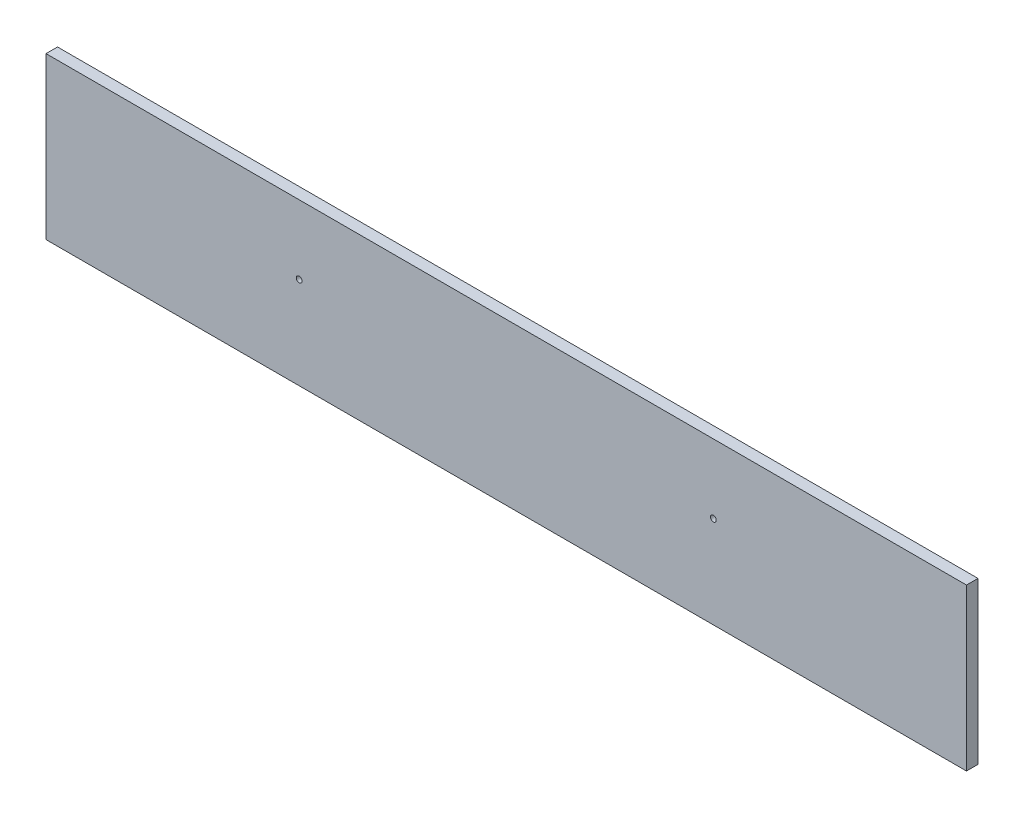
ISO-10303-21;
HEADER;
FILE_DESCRIPTION(('STEP AP214'),'2;1');
FILE_NAME('part.step','',(''),(''),'','','');
FILE_SCHEMA(('AUTOMOTIVE_DESIGN { 1 0 10303 214 1 1 1 1 }'));
ENDSEC;
DATA;
#1=APPLICATION_CONTEXT('core data for automotive mechanical design processes');
#2=APPLICATION_PROTOCOL_DEFINITION('international standard','automotive_design',2000,#1);
#3=PRODUCT_CONTEXT('',#1,'mechanical');
#4=PRODUCT('Part','Part','',(#3));
#5=PRODUCT_RELATED_PRODUCT_CATEGORY('part','',(#4));
#6=PRODUCT_DEFINITION_FORMATION('','',#4);
#7=PRODUCT_DEFINITION_CONTEXT('part definition',#1,'design');
#8=PRODUCT_DEFINITION('design','',#6,#7);
#9=PRODUCT_DEFINITION_SHAPE('','',#8);
#10=(LENGTH_UNIT() NAMED_UNIT(*) SI_UNIT(.MILLI.,.METRE.));
#11=(NAMED_UNIT(*) PLANE_ANGLE_UNIT() SI_UNIT($,.RADIAN.));
#12=(NAMED_UNIT(*) SI_UNIT($,.STERADIAN.) SOLID_ANGLE_UNIT());
#13=UNCERTAINTY_MEASURE_WITH_UNIT(LENGTH_MEASURE(1.E-05),#10,'distance_accuracy_value','');
#14=(GEOMETRIC_REPRESENTATION_CONTEXT(3) GLOBAL_UNCERTAINTY_ASSIGNED_CONTEXT((#13)) GLOBAL_UNIT_ASSIGNED_CONTEXT((#10,
#11,#12)) REPRESENTATION_CONTEXT('',''));
#15=CARTESIAN_POINT('',(0.,0.,0.));
#16=DIRECTION('',(0.,0.,1.));
#17=DIRECTION('',(1.,0.,0.));
#18=AXIS2_PLACEMENT_3D('',#15,#16,#17);
#19=CARTESIAN_POINT('',(0.,0.,5.));
#20=DIRECTION('',(0.,0.,-1.));
#21=DIRECTION('',(-1.,0.,0.));
#22=AXIS2_PLACEMENT_3D('',#19,#20,#21);
#23=PLANE('',#22);
#24=DIRECTION('',(0.,1.,0.));
#25=VECTOR('',#24,1.);
#26=CARTESIAN_POINT('',(200.,-40.,5.));
#27=LINE('',#26,#25);
#28=CARTESIAN_POINT('',(200.,-40.,5.));
#29=VERTEX_POINT('',#28);
#30=CARTESIAN_POINT('',(200.,30.,5.));
#31=VERTEX_POINT('',#30);
#32=EDGE_CURVE('E85',#29,#31,#27,.T.);
#33=ORIENTED_EDGE('',*,*,#32,.T.);
#34=DIRECTION('',(-1.,0.,0.));
#35=VECTOR('',#34,1.);
#36=CARTESIAN_POINT('',(-200.,30.,5.));
#37=LINE('',#36,#35);
#38=CARTESIAN_POINT('',(-200.,30.,5.));
#39=VERTEX_POINT('',#38);
#40=EDGE_CURVE('E80',#31,#39,#37,.T.);
#41=ORIENTED_EDGE('',*,*,#40,.T.);
#42=DIRECTION('',(0.,-1.,0.));
#43=VECTOR('',#42,1.);
#44=CARTESIAN_POINT('',(-200.,-40.,5.));
#45=LINE('',#44,#43);
#46=CARTESIAN_POINT('',(-200.,-40.,5.));
#47=VERTEX_POINT('',#46);
#48=EDGE_CURVE('E83',#39,#47,#45,.T.);
#49=ORIENTED_EDGE('',*,*,#48,.T.);
#50=DIRECTION('',(1.,0.,0.));
#51=VECTOR('',#50,1.);
#52=CARTESIAN_POINT('',(-200.,-40.,5.));
#53=LINE('',#52,#51);
#54=EDGE_CURVE('E50',#47,#29,#53,.T.);
#55=ORIENTED_EDGE('',*,*,#54,.T.);
#56=EDGE_LOOP('',(#33,#41,#49,#55));
#57=FACE_BOUND('',#56,.T.);
#58=CARTESIAN_POINT('',(-90.,0.,5.));
#59=DIRECTION('',(0.,0.,1.));
#60=DIRECTION('',(1.,0.,0.));
#61=AXIS2_PLACEMENT_3D('',#58,#59,#60);
#62=CIRCLE('',#61,1.25);
#63=CARTESIAN_POINT('',(-88.75,0.,5.));
#64=VERTEX_POINT('',#63);
#65=EDGE_CURVE('E100',#64,#64,#62,.T.);
#66=ORIENTED_EDGE('',*,*,#65,.F.);
#67=EDGE_LOOP('',(#66));
#68=FACE_BOUND('',#67,.T.);
#69=CARTESIAN_POINT('',(90.,0.,5.));
#70=DIRECTION('',(0.,0.,1.));
#71=DIRECTION('',(-1.,0.,0.));
#72=AXIS2_PLACEMENT_3D('',#69,#70,#71);
#73=CIRCLE('',#72,1.25);
#74=CARTESIAN_POINT('',(88.75,0.,5.));
#75=VERTEX_POINT('',#74);
#76=EDGE_CURVE('E115',#75,#75,#73,.T.);
#77=ORIENTED_EDGE('',*,*,#76,.F.);
#78=EDGE_LOOP('',(#77));
#79=FACE_BOUND('',#78,.T.);
#80=ADVANCED_FACE('F33',(#57,#68,#79),#23,.F.);
#81=CARTESIAN_POINT('',(0.,0.,0.));
#82=DIRECTION('',(0.,0.,-1.));
#83=DIRECTION('',(-1.,0.,0.));
#84=AXIS2_PLACEMENT_3D('',#81,#82,#83);
#85=PLANE('',#84);
#86=CARTESIAN_POINT('',(-90.,0.,0.));
#87=DIRECTION('',(0.,0.,1.));
#88=DIRECTION('',(1.,0.,0.));
#89=AXIS2_PLACEMENT_3D('',#86,#87,#88);
#90=CIRCLE('',#89,1.25);
#91=CARTESIAN_POINT('',(-88.75,0.,0.));
#92=VERTEX_POINT('',#91);
#93=EDGE_CURVE('E112',#92,#92,#90,.T.);
#94=ORIENTED_EDGE('',*,*,#93,.T.);
#95=EDGE_LOOP('',(#94));
#96=FACE_BOUND('',#95,.T.);
#97=DIRECTION('',(0.,1.,0.));
#98=VECTOR('',#97,1.);
#99=CARTESIAN_POINT('',(200.,-40.,0.));
#100=LINE('',#99,#98);
#101=CARTESIAN_POINT('',(200.,-40.,0.));
#102=VERTEX_POINT('',#101);
#103=CARTESIAN_POINT('',(200.,30.,0.));
#104=VERTEX_POINT('',#103);
#105=EDGE_CURVE('E97',#102,#104,#100,.T.);
#106=ORIENTED_EDGE('',*,*,#105,.F.);
#107=DIRECTION('',(1.,0.,0.));
#108=VECTOR('',#107,1.);
#109=CARTESIAN_POINT('',(-200.,-40.,0.));
#110=LINE('',#109,#108);
#111=CARTESIAN_POINT('',(-200.,-40.,0.));
#112=VERTEX_POINT('',#111);
#113=EDGE_CURVE('E73',#112,#102,#110,.T.);
#114=ORIENTED_EDGE('',*,*,#113,.F.);
#115=DIRECTION('',(0.,-1.,0.));
#116=VECTOR('',#115,1.);
#117=CARTESIAN_POINT('',(-200.,-40.,0.));
#118=LINE('',#117,#116);
#119=CARTESIAN_POINT('',(-200.,30.,0.));
#120=VERTEX_POINT('',#119);
#121=EDGE_CURVE('E67',#120,#112,#118,.T.);
#122=ORIENTED_EDGE('',*,*,#121,.F.);
#123=DIRECTION('',(-1.,0.,0.));
#124=VECTOR('',#123,1.);
#125=CARTESIAN_POINT('',(-200.,30.,0.));
#126=LINE('',#125,#124);
#127=EDGE_CURVE('E89',#104,#120,#126,.T.);
#128=ORIENTED_EDGE('',*,*,#127,.F.);
#129=EDGE_LOOP('',(#106,#114,#122,#128));
#130=FACE_BOUND('',#129,.T.);
#131=CARTESIAN_POINT('',(90.,0.,0.));
#132=DIRECTION('',(0.,0.,1.));
#133=DIRECTION('',(-1.,0.,0.));
#134=AXIS2_PLACEMENT_3D('',#131,#132,#133);
#135=CIRCLE('',#134,1.25);
#136=CARTESIAN_POINT('',(88.75,0.,0.));
#137=VERTEX_POINT('',#136);
#138=EDGE_CURVE('E118',#137,#137,#135,.T.);
#139=ORIENTED_EDGE('',*,*,#138,.T.);
#140=EDGE_LOOP('',(#139));
#141=FACE_BOUND('',#140,.T.);
#142=ADVANCED_FACE('F108',(#96,#130,#141),#85,.T.);
#143=CARTESIAN_POINT('',(200.,-40.,5.));
#144=DIRECTION('',(-1.,0.,0.));
#145=DIRECTION('',(0.,0.,1.));
#146=AXIS2_PLACEMENT_3D('',#143,#144,#145);
#147=PLANE('',#146);
#148=ORIENTED_EDGE('',*,*,#105,.T.);
#149=DIRECTION('',(0.,0.,-1.));
#150=VECTOR('',#149,1.);
#151=CARTESIAN_POINT('',(200.,30.,5.));
#152=LINE('',#151,#150);
#153=EDGE_CURVE('E11',#31,#104,#152,.T.);
#154=ORIENTED_EDGE('',*,*,#153,.F.);
#155=ORIENTED_EDGE('',*,*,#32,.F.);
#156=DIRECTION('',(0.,0.,-1.));
#157=VECTOR('',#156,1.);
#158=CARTESIAN_POINT('',(200.,-40.,5.));
#159=LINE('',#158,#157);
#160=EDGE_CURVE('E93',#29,#102,#159,.T.);
#161=ORIENTED_EDGE('',*,*,#160,.T.);
#162=EDGE_LOOP('',(#148,#154,#155,#161));
#163=FACE_BOUND('',#162,.T.);
#164=ADVANCED_FACE('F35',(#163),#147,.F.);
#165=CARTESIAN_POINT('',(-200.,30.,5.));
#166=DIRECTION('',(0.,-1.,0.));
#167=DIRECTION('',(1.,0.,0.));
#168=AXIS2_PLACEMENT_3D('',#165,#166,#167);
#169=PLANE('',#168);
#170=ORIENTED_EDGE('',*,*,#127,.T.);
#171=DIRECTION('',(0.,0.,-1.));
#172=VECTOR('',#171,1.);
#173=CARTESIAN_POINT('',(-200.,30.,5.));
#174=LINE('',#173,#172);
#175=EDGE_CURVE('E42',#39,#120,#174,.T.);
#176=ORIENTED_EDGE('',*,*,#175,.F.);
#177=ORIENTED_EDGE('',*,*,#40,.F.);
#178=ORIENTED_EDGE('',*,*,#153,.T.);
#179=EDGE_LOOP('',(#170,#176,#177,#178));
#180=FACE_BOUND('',#179,.T.);
#181=ADVANCED_FACE('F88',(#180),#169,.F.);
#182=CARTESIAN_POINT('',(-200.,-40.,5.));
#183=DIRECTION('',(1.,0.,0.));
#184=DIRECTION('',(0.,0.,-1.));
#185=AXIS2_PLACEMENT_3D('',#182,#183,#184);
#186=PLANE('',#185);
#187=ORIENTED_EDGE('',*,*,#121,.T.);
#188=DIRECTION('',(0.,0.,-1.));
#189=VECTOR('',#188,1.);
#190=CARTESIAN_POINT('',(-200.,-40.,5.));
#191=LINE('',#190,#189);
#192=EDGE_CURVE('E90',#47,#112,#191,.T.);
#193=ORIENTED_EDGE('',*,*,#192,.F.);
#194=ORIENTED_EDGE('',*,*,#48,.F.);
#195=ORIENTED_EDGE('',*,*,#175,.T.);
#196=EDGE_LOOP('',(#187,#193,#194,#195));
#197=FACE_BOUND('',#196,.T.);
#198=ADVANCED_FACE('F91',(#197),#186,.F.);
#199=CARTESIAN_POINT('',(-200.,-40.,5.));
#200=DIRECTION('',(0.,1.,0.));
#201=DIRECTION('',(-1.,0.,0.));
#202=AXIS2_PLACEMENT_3D('',#199,#200,#201);
#203=PLANE('',#202);
#204=ORIENTED_EDGE('',*,*,#113,.T.);
#205=ORIENTED_EDGE('',*,*,#160,.F.);
#206=ORIENTED_EDGE('',*,*,#54,.F.);
#207=ORIENTED_EDGE('',*,*,#192,.T.);
#208=EDGE_LOOP('',(#204,#205,#206,#207));
#209=FACE_BOUND('',#208,.T.);
#210=ADVANCED_FACE('F105',(#209),#203,.F.);
#211=CARTESIAN_POINT('',(-90.,0.,5.));
#212=DIRECTION('',(0.,0.,-1.));
#213=DIRECTION('',(-1.,0.,0.));
#214=AXIS2_PLACEMENT_3D('',#211,#212,#213);
#215=CYLINDRICAL_SURFACE('',#214,1.25);
#216=ORIENTED_EDGE('',*,*,#65,.T.);
#217=EDGE_LOOP('',(#216));
#218=FACE_BOUND('',#217,.T.);
#219=ORIENTED_EDGE('',*,*,#93,.F.);
#220=EDGE_LOOP('',(#219));
#221=FACE_BOUND('',#220,.T.);
#222=ADVANCED_FACE('F135',(#218,#221),#215,.F.);
#223=CARTESIAN_POINT('',(90.,0.,5.));
#224=DIRECTION('',(0.,0.,-1.));
#225=DIRECTION('',(-1.,0.,0.));
#226=AXIS2_PLACEMENT_3D('',#223,#224,#225);
#227=CYLINDRICAL_SURFACE('',#226,1.25);
#228=ORIENTED_EDGE('',*,*,#76,.T.);
#229=EDGE_LOOP('',(#228));
#230=FACE_BOUND('',#229,.T.);
#231=ORIENTED_EDGE('',*,*,#138,.F.);
#232=EDGE_LOOP('',(#231));
#233=FACE_BOUND('',#232,.T.);
#234=ADVANCED_FACE('F124',(#230,#233),#227,.F.);
#235=CLOSED_SHELL('',(#80,#142,#164,#181,#198,#210,#222,#234));
#236=MANIFOLD_SOLID_BREP('B2',#235);
#237=ADVANCED_BREP_SHAPE_REPRESENTATION('',(#18,#236),#14);
#238=SHAPE_DEFINITION_REPRESENTATION(#9,#237);
ENDSEC;
END-ISO-10303-21;
